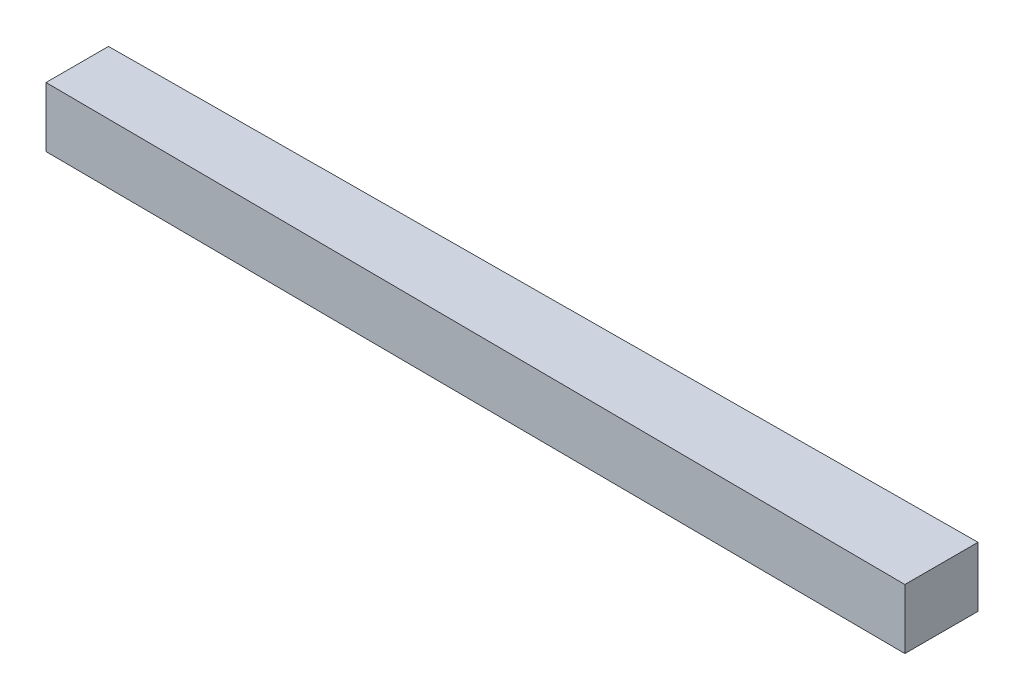
ISO-10303-21;
HEADER;
FILE_DESCRIPTION(('STEP AP214'),'2;1');
FILE_NAME('part.step','',(''),(''),'','','');
FILE_SCHEMA(('AUTOMOTIVE_DESIGN { 1 0 10303 214 1 1 1 1 }'));
ENDSEC;
DATA;
#1=APPLICATION_CONTEXT('core data for automotive mechanical design processes');
#2=APPLICATION_PROTOCOL_DEFINITION('international standard','automotive_design',2000,#1);
#3=PRODUCT_CONTEXT('',#1,'mechanical');
#4=PRODUCT('Part','Part','',(#3));
#5=PRODUCT_RELATED_PRODUCT_CATEGORY('part','',(#4));
#6=PRODUCT_DEFINITION_FORMATION('','',#4);
#7=PRODUCT_DEFINITION_CONTEXT('part definition',#1,'design');
#8=PRODUCT_DEFINITION('design','',#6,#7);
#9=PRODUCT_DEFINITION_SHAPE('','',#8);
#10=(LENGTH_UNIT() NAMED_UNIT(*) SI_UNIT(.MILLI.,.METRE.));
#11=(NAMED_UNIT(*) PLANE_ANGLE_UNIT() SI_UNIT($,.RADIAN.));
#12=(NAMED_UNIT(*) SI_UNIT($,.STERADIAN.) SOLID_ANGLE_UNIT());
#13=UNCERTAINTY_MEASURE_WITH_UNIT(LENGTH_MEASURE(1.E-05),#10,'distance_accuracy_value','');
#14=(GEOMETRIC_REPRESENTATION_CONTEXT(3) GLOBAL_UNCERTAINTY_ASSIGNED_CONTEXT((#13)) GLOBAL_UNIT_ASSIGNED_CONTEXT((#10,
#11,#12)) REPRESENTATION_CONTEXT('',''));
#15=CARTESIAN_POINT('',(0.,0.,0.));
#16=DIRECTION('',(0.,0.,1.));
#17=DIRECTION('',(1.,0.,0.));
#18=AXIS2_PLACEMENT_3D('',#15,#16,#17);
#19=CARTESIAN_POINT('',(-32.5,4.5,-2.35));
#20=DIRECTION('',(0.00615372963462484,0.,0.999981065626537));
#21=DIRECTION('',(0.999981065626537,0.,-0.00615372963462484));
#22=AXIS2_PLACEMENT_3D('',#19,#20,#21);
#23=PLANE('',#22);
#24=DIRECTION('',(-0.999981065626537,0.,0.00615372963462484));
#25=VECTOR('',#24,1.);
#26=CARTESIAN_POINT('',(-32.5,0.,-2.35));
#27=LINE('',#26,#25);
#28=CARTESIAN_POINT('',(32.5,0.,-2.75));
#29=VERTEX_POINT('',#28);
#30=CARTESIAN_POINT('',(-32.5,0.,-2.35));
#31=VERTEX_POINT('',#30);
#32=EDGE_CURVE('E107',#29,#31,#27,.T.);
#33=ORIENTED_EDGE('',*,*,#32,.T.);
#34=DIRECTION('',(0.,-1.,0.));
#35=VECTOR('',#34,1.);
#36=CARTESIAN_POINT('',(-32.5,4.5,-2.35));
#37=LINE('',#36,#35);
#38=CARTESIAN_POINT('',(-32.5,4.5,-2.35));
#39=VERTEX_POINT('',#38);
#40=EDGE_CURVE('E11',#39,#31,#37,.T.);
#41=ORIENTED_EDGE('',*,*,#40,.F.);
#42=DIRECTION('',(-0.999981065626537,0.,0.00615372963462484));
#43=VECTOR('',#42,1.);
#44=CARTESIAN_POINT('',(-32.5,4.5,-2.35));
#45=LINE('',#44,#43);
#46=CARTESIAN_POINT('',(32.5,4.5,-2.75));
#47=VERTEX_POINT('',#46);
#48=EDGE_CURVE('E91',#47,#39,#45,.T.);
#49=ORIENTED_EDGE('',*,*,#48,.F.);
#50=DIRECTION('',(0.,-1.,0.));
#51=VECTOR('',#50,1.);
#52=CARTESIAN_POINT('',(32.5,4.5,-2.75));
#53=LINE('',#52,#51);
#54=EDGE_CURVE('E103',#47,#29,#53,.T.);
#55=ORIENTED_EDGE('',*,*,#54,.T.);
#56=EDGE_LOOP('',(#33,#41,#49,#55));
#57=FACE_BOUND('',#56,.T.);
#58=ADVANCED_FACE('F39',(#57),#23,.F.);
#59=CARTESIAN_POINT('',(-32.5,4.5,2.35));
#60=DIRECTION('',(1.,0.,0.));
#61=DIRECTION('',(0.,0.,-1.));
#62=AXIS2_PLACEMENT_3D('',#59,#60,#61);
#63=PLANE('',#62);
#64=DIRECTION('',(0.,0.,1.));
#65=VECTOR('',#64,1.);
#66=CARTESIAN_POINT('',(-32.5,0.,2.35));
#67=LINE('',#66,#65);
#68=CARTESIAN_POINT('',(-32.5,0.,2.35));
#69=VERTEX_POINT('',#68);
#70=EDGE_CURVE('E96',#31,#69,#67,.T.);
#71=ORIENTED_EDGE('',*,*,#70,.T.);
#72=DIRECTION('',(0.,-1.,0.));
#73=VECTOR('',#72,1.);
#74=CARTESIAN_POINT('',(-32.5,4.5,2.35));
#75=LINE('',#74,#73);
#76=CARTESIAN_POINT('',(-32.5,4.5,2.35));
#77=VERTEX_POINT('',#76);
#78=EDGE_CURVE('E48',#77,#69,#75,.T.);
#79=ORIENTED_EDGE('',*,*,#78,.F.);
#80=DIRECTION('',(0.,0.,1.));
#81=VECTOR('',#80,1.);
#82=CARTESIAN_POINT('',(-32.5,4.5,2.35));
#83=LINE('',#82,#81);
#84=EDGE_CURVE('E86',#39,#77,#83,.T.);
#85=ORIENTED_EDGE('',*,*,#84,.F.);
#86=ORIENTED_EDGE('',*,*,#40,.T.);
#87=EDGE_LOOP('',(#71,#79,#85,#86));
#88=FACE_BOUND('',#87,.T.);
#89=ADVANCED_FACE('F95',(#88),#63,.F.);
#90=CARTESIAN_POINT('',(-32.5,4.5,2.35));
#91=DIRECTION('',(0.00615372963462484,0.,-0.999981065626537));
#92=DIRECTION('',(-0.999981065626537,0.,-0.00615372963462484));
#93=AXIS2_PLACEMENT_3D('',#90,#91,#92);
#94=PLANE('',#93);
#95=DIRECTION('',(0.999981065626537,0.,0.00615372963462484));
#96=VECTOR('',#95,1.);
#97=CARTESIAN_POINT('',(-32.5,0.,2.35));
#98=LINE('',#97,#96);
#99=CARTESIAN_POINT('',(32.5,0.,2.75));
#100=VERTEX_POINT('',#99);
#101=EDGE_CURVE('E73',#69,#100,#98,.T.);
#102=ORIENTED_EDGE('',*,*,#101,.T.);
#103=DIRECTION('',(0.,-1.,0.));
#104=VECTOR('',#103,1.);
#105=CARTESIAN_POINT('',(32.5,4.5,2.75));
#106=LINE('',#105,#104);
#107=CARTESIAN_POINT('',(32.5,4.5,2.75));
#108=VERTEX_POINT('',#107);
#109=EDGE_CURVE('E98',#108,#100,#106,.T.);
#110=ORIENTED_EDGE('',*,*,#109,.F.);
#111=DIRECTION('',(0.999981065626537,0.,0.00615372963462484));
#112=VECTOR('',#111,1.);
#113=CARTESIAN_POINT('',(-32.5,4.5,2.35));
#114=LINE('',#113,#112);
#115=EDGE_CURVE('E89',#77,#108,#114,.T.);
#116=ORIENTED_EDGE('',*,*,#115,.F.);
#117=ORIENTED_EDGE('',*,*,#78,.T.);
#118=EDGE_LOOP('',(#102,#110,#116,#117));
#119=FACE_BOUND('',#118,.T.);
#120=ADVANCED_FACE('F99',(#119),#94,.F.);
#121=CARTESIAN_POINT('',(32.5,4.5,-2.75));
#122=DIRECTION('',(-1.,0.,0.));
#123=DIRECTION('',(0.,0.,1.));
#124=AXIS2_PLACEMENT_3D('',#121,#122,#123);
#125=PLANE('',#124);
#126=DIRECTION('',(0.,0.,-1.));
#127=VECTOR('',#126,1.);
#128=CARTESIAN_POINT('',(32.5,0.,-2.75));
#129=LINE('',#128,#127);
#130=EDGE_CURVE('E79',#100,#29,#129,.T.);
#131=ORIENTED_EDGE('',*,*,#130,.T.);
#132=ORIENTED_EDGE('',*,*,#54,.F.);
#133=DIRECTION('',(0.,0.,-1.));
#134=VECTOR('',#133,1.);
#135=CARTESIAN_POINT('',(32.5,4.5,-2.75));
#136=LINE('',#135,#134);
#137=EDGE_CURVE('E56',#108,#47,#136,.T.);
#138=ORIENTED_EDGE('',*,*,#137,.F.);
#139=ORIENTED_EDGE('',*,*,#109,.T.);
#140=EDGE_LOOP('',(#131,#132,#138,#139));
#141=FACE_BOUND('',#140,.T.);
#142=ADVANCED_FACE('F120',(#141),#125,.F.);
#143=CARTESIAN_POINT('',(0.,4.5,0.));
#144=DIRECTION('',(0.,-1.,0.));
#145=DIRECTION('',(0.,0.,-1.));
#146=AXIS2_PLACEMENT_3D('',#143,#144,#145);
#147=PLANE('',#146);
#148=ORIENTED_EDGE('',*,*,#48,.T.);
#149=ORIENTED_EDGE('',*,*,#84,.T.);
#150=ORIENTED_EDGE('',*,*,#115,.T.);
#151=ORIENTED_EDGE('',*,*,#137,.T.);
#152=EDGE_LOOP('',(#148,#149,#150,#151));
#153=FACE_BOUND('',#152,.T.);
#154=ADVANCED_FACE('F87',(#153),#147,.F.);
#155=CARTESIAN_POINT('',(0.,0.,0.));
#156=DIRECTION('',(0.,-1.,0.));
#157=DIRECTION('',(0.,0.,-1.));
#158=AXIS2_PLACEMENT_3D('',#155,#156,#157);
#159=PLANE('',#158);
#160=ORIENTED_EDGE('',*,*,#32,.F.);
#161=ORIENTED_EDGE('',*,*,#130,.F.);
#162=ORIENTED_EDGE('',*,*,#101,.F.);
#163=ORIENTED_EDGE('',*,*,#70,.F.);
#164=EDGE_LOOP('',(#160,#161,#162,#163));
#165=FACE_BOUND('',#164,.T.);
#166=ADVANCED_FACE('F123',(#165),#159,.T.);
#167=CLOSED_SHELL('',(#58,#89,#120,#142,#154,#166));
#168=MANIFOLD_SOLID_BREP('B2',#167);
#169=ADVANCED_BREP_SHAPE_REPRESENTATION('',(#18,#168),#14);
#170=SHAPE_DEFINITION_REPRESENTATION(#9,#169);
ENDSEC;
END-ISO-10303-21;
